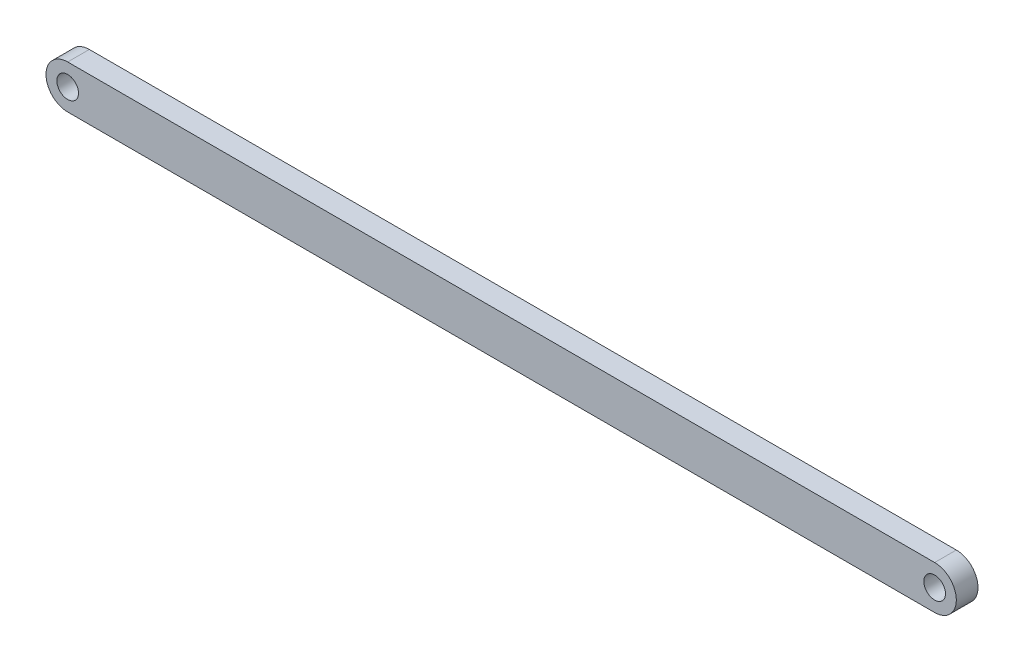
ISO-10303-21;
HEADER;
FILE_DESCRIPTION(('STEP AP214'),'2;1');
FILE_NAME('part.step','',(''),(''),'','','');
FILE_SCHEMA(('AUTOMOTIVE_DESIGN { 1 0 10303 214 1 1 1 1 }'));
ENDSEC;
DATA;
#1=APPLICATION_CONTEXT('core data for automotive mechanical design processes');
#2=APPLICATION_PROTOCOL_DEFINITION('international standard','automotive_design',2000,#1);
#3=PRODUCT_CONTEXT('',#1,'mechanical');
#4=PRODUCT('Part','Part','',(#3));
#5=PRODUCT_RELATED_PRODUCT_CATEGORY('part','',(#4));
#6=PRODUCT_DEFINITION_FORMATION('','',#4);
#7=PRODUCT_DEFINITION_CONTEXT('part definition',#1,'design');
#8=PRODUCT_DEFINITION('design','',#6,#7);
#9=PRODUCT_DEFINITION_SHAPE('','',#8);
#10=(LENGTH_UNIT() NAMED_UNIT(*) SI_UNIT(.MILLI.,.METRE.));
#11=(NAMED_UNIT(*) PLANE_ANGLE_UNIT() SI_UNIT($,.RADIAN.));
#12=(NAMED_UNIT(*) SI_UNIT($,.STERADIAN.) SOLID_ANGLE_UNIT());
#13=UNCERTAINTY_MEASURE_WITH_UNIT(LENGTH_MEASURE(1.E-05),#10,'distance_accuracy_value','');
#14=(GEOMETRIC_REPRESENTATION_CONTEXT(3) GLOBAL_UNCERTAINTY_ASSIGNED_CONTEXT((#13)) GLOBAL_UNIT_ASSIGNED_CONTEXT((#10,
#11,#12)) REPRESENTATION_CONTEXT('',''));
#15=CARTESIAN_POINT('',(0.,0.,0.));
#16=DIRECTION('',(0.,0.,1.));
#17=DIRECTION('',(1.,0.,0.));
#18=AXIS2_PLACEMENT_3D('',#15,#16,#17);
#19=CARTESIAN_POINT('',(0.,0.,5.));
#20=DIRECTION('',(0.,0.,1.));
#21=DIRECTION('',(1.,0.,0.));
#22=AXIS2_PLACEMENT_3D('',#19,#20,#21);
#23=PLANE('',#22);
#24=CARTESIAN_POINT('',(0.,0.,5.));
#25=DIRECTION('',(0.,0.,1.));
#26=DIRECTION('',(1.,0.,0.));
#27=AXIS2_PLACEMENT_3D('',#24,#25,#26);
#28=CIRCLE('',#27,2.5);
#29=CARTESIAN_POINT('',(2.5,0.,5.));
#30=VERTEX_POINT('',#29);
#31=EDGE_CURVE('E118',#30,#30,#28,.T.);
#32=ORIENTED_EDGE('',*,*,#31,.F.);
#33=EDGE_LOOP('',(#32));
#34=FACE_BOUND('',#33,.T.);
#35=CARTESIAN_POINT('',(0.,0.,5.));
#36=DIRECTION('',(0.,0.,1.));
#37=DIRECTION('',(1.,0.,0.));
#38=AXIS2_PLACEMENT_3D('',#35,#36,#37);
#39=CIRCLE('',#38,5.);
#40=CARTESIAN_POINT('',(0.,5.,5.));
#41=VERTEX_POINT('',#40);
#42=CARTESIAN_POINT('',(0.,-5.,5.));
#43=VERTEX_POINT('',#42);
#44=EDGE_CURVE('E98',#41,#43,#39,.T.);
#45=ORIENTED_EDGE('',*,*,#44,.T.);
#46=DIRECTION('',(1.,0.,0.));
#47=VECTOR('',#46,1.);
#48=CARTESIAN_POINT('',(0.,-5.,5.));
#49=LINE('',#48,#47);
#50=CARTESIAN_POINT('',(200.,-5.,5.));
#51=VERTEX_POINT('',#50);
#52=EDGE_CURVE('E93',#43,#51,#49,.T.);
#53=ORIENTED_EDGE('',*,*,#52,.T.);
#54=CARTESIAN_POINT('',(200.,0.,5.));
#55=DIRECTION('',(0.,0.,1.));
#56=DIRECTION('',(1.,0.,0.));
#57=AXIS2_PLACEMENT_3D('',#54,#55,#56);
#58=CIRCLE('',#57,5.);
#59=CARTESIAN_POINT('',(200.,5.,5.));
#60=VERTEX_POINT('',#59);
#61=EDGE_CURVE('E96',#51,#60,#58,.T.);
#62=ORIENTED_EDGE('',*,*,#61,.T.);
#63=DIRECTION('',(-1.,0.,0.));
#64=VECTOR('',#63,1.);
#65=CARTESIAN_POINT('',(0.,5.,5.));
#66=LINE('',#65,#64);
#67=EDGE_CURVE('E63',#60,#41,#66,.T.);
#68=ORIENTED_EDGE('',*,*,#67,.T.);
#69=EDGE_LOOP('',(#45,#53,#62,#68));
#70=FACE_BOUND('',#69,.T.);
#71=CARTESIAN_POINT('',(200.,0.,5.));
#72=DIRECTION('',(0.,0.,1.));
#73=DIRECTION('',(1.,0.,0.));
#74=AXIS2_PLACEMENT_3D('',#71,#72,#73);
#75=CIRCLE('',#74,2.5);
#76=CARTESIAN_POINT('',(202.5,0.,5.));
#77=VERTEX_POINT('',#76);
#78=EDGE_CURVE('E140',#77,#77,#75,.T.);
#79=ORIENTED_EDGE('',*,*,#78,.F.);
#80=EDGE_LOOP('',(#79));
#81=FACE_BOUND('',#80,.T.);
#82=ADVANCED_FACE('F45',(#34,#70,#81),#23,.T.);
#83=CARTESIAN_POINT('',(0.,0.,0.));
#84=DIRECTION('',(0.,0.,1.));
#85=DIRECTION('',(1.,0.,0.));
#86=AXIS2_PLACEMENT_3D('',#83,#84,#85);
#87=PLANE('',#86);
#88=CARTESIAN_POINT('',(0.,0.,0.));
#89=DIRECTION('',(0.,0.,1.));
#90=DIRECTION('',(1.,0.,0.));
#91=AXIS2_PLACEMENT_3D('',#88,#89,#90);
#92=CIRCLE('',#91,5.);
#93=CARTESIAN_POINT('',(0.,5.,0.));
#94=VERTEX_POINT('',#93);
#95=CARTESIAN_POINT('',(0.,-5.,0.));
#96=VERTEX_POINT('',#95);
#97=EDGE_CURVE('E114',#94,#96,#92,.T.);
#98=ORIENTED_EDGE('',*,*,#97,.F.);
#99=DIRECTION('',(-1.,0.,0.));
#100=VECTOR('',#99,1.);
#101=CARTESIAN_POINT('',(0.,5.,0.));
#102=LINE('',#101,#100);
#103=CARTESIAN_POINT('',(200.,5.,0.));
#104=VERTEX_POINT('',#103);
#105=EDGE_CURVE('E86',#104,#94,#102,.T.);
#106=ORIENTED_EDGE('',*,*,#105,.F.);
#107=CARTESIAN_POINT('',(200.,0.,0.));
#108=DIRECTION('',(0.,0.,1.));
#109=DIRECTION('',(1.,0.,0.));
#110=AXIS2_PLACEMENT_3D('',#107,#108,#109);
#111=CIRCLE('',#110,5.);
#112=CARTESIAN_POINT('',(200.,-5.,0.));
#113=VERTEX_POINT('',#112);
#114=EDGE_CURVE('E80',#113,#104,#111,.T.);
#115=ORIENTED_EDGE('',*,*,#114,.F.);
#116=DIRECTION('',(1.,0.,0.));
#117=VECTOR('',#116,1.);
#118=CARTESIAN_POINT('',(0.,-5.,0.));
#119=LINE('',#118,#117);
#120=EDGE_CURVE('E103',#96,#113,#119,.T.);
#121=ORIENTED_EDGE('',*,*,#120,.F.);
#122=EDGE_LOOP('',(#98,#106,#115,#121));
#123=FACE_BOUND('',#122,.T.);
#124=CARTESIAN_POINT('',(0.,0.,0.));
#125=DIRECTION('',(0.,0.,1.));
#126=DIRECTION('',(1.,0.,0.));
#127=AXIS2_PLACEMENT_3D('',#124,#125,#126);
#128=CIRCLE('',#127,2.5);
#129=CARTESIAN_POINT('',(2.5,0.,0.));
#130=VERTEX_POINT('',#129);
#131=EDGE_CURVE('E136',#130,#130,#128,.T.);
#132=ORIENTED_EDGE('',*,*,#131,.T.);
#133=EDGE_LOOP('',(#132));
#134=FACE_BOUND('',#133,.T.);
#135=CARTESIAN_POINT('',(200.,0.,0.));
#136=DIRECTION('',(0.,0.,1.));
#137=DIRECTION('',(1.,0.,0.));
#138=AXIS2_PLACEMENT_3D('',#135,#136,#137);
#139=CIRCLE('',#138,2.5);
#140=CARTESIAN_POINT('',(202.5,0.,0.));
#141=VERTEX_POINT('',#140);
#142=EDGE_CURVE('E144',#141,#141,#139,.T.);
#143=ORIENTED_EDGE('',*,*,#142,.T.);
#144=EDGE_LOOP('',(#143));
#145=FACE_BOUND('',#144,.T.);
#146=ADVANCED_FACE('F131',(#123,#134,#145),#87,.F.);
#147=CARTESIAN_POINT('',(0.,0.,5.));
#148=DIRECTION('',(0.,0.,-1.));
#149=DIRECTION('',(-1.,0.,0.));
#150=AXIS2_PLACEMENT_3D('',#147,#148,#149);
#151=CYLINDRICAL_SURFACE('',#150,5.);
#152=ORIENTED_EDGE('',*,*,#97,.T.);
#153=DIRECTION('',(0.,0.,-1.));
#154=VECTOR('',#153,1.);
#155=CARTESIAN_POINT('',(0.,-5.,5.));
#156=LINE('',#155,#154);
#157=EDGE_CURVE('E11',#43,#96,#156,.T.);
#158=ORIENTED_EDGE('',*,*,#157,.F.);
#159=ORIENTED_EDGE('',*,*,#44,.F.);
#160=DIRECTION('',(0.,0.,-1.));
#161=VECTOR('',#160,1.);
#162=CARTESIAN_POINT('',(0.,5.,5.));
#163=LINE('',#162,#161);
#164=EDGE_CURVE('E110',#41,#94,#163,.T.);
#165=ORIENTED_EDGE('',*,*,#164,.T.);
#166=EDGE_LOOP('',(#152,#158,#159,#165));
#167=FACE_BOUND('',#166,.T.);
#168=ADVANCED_FACE('F47',(#167),#151,.T.);
#169=CARTESIAN_POINT('',(0.,-5.,5.));
#170=DIRECTION('',(0.,1.,0.));
#171=DIRECTION('',(0.,0.,1.));
#172=AXIS2_PLACEMENT_3D('',#169,#170,#171);
#173=PLANE('',#172);
#174=ORIENTED_EDGE('',*,*,#120,.T.);
#175=DIRECTION('',(0.,0.,-1.));
#176=VECTOR('',#175,1.);
#177=CARTESIAN_POINT('',(200.,-5.,5.));
#178=LINE('',#177,#176);
#179=EDGE_CURVE('E55',#51,#113,#178,.T.);
#180=ORIENTED_EDGE('',*,*,#179,.F.);
#181=ORIENTED_EDGE('',*,*,#52,.F.);
#182=ORIENTED_EDGE('',*,*,#157,.T.);
#183=EDGE_LOOP('',(#174,#180,#181,#182));
#184=FACE_BOUND('',#183,.T.);
#185=ADVANCED_FACE('F102',(#184),#173,.F.);
#186=CARTESIAN_POINT('',(200.,0.,5.));
#187=DIRECTION('',(0.,0.,-1.));
#188=DIRECTION('',(-1.,0.,0.));
#189=AXIS2_PLACEMENT_3D('',#186,#187,#188);
#190=CYLINDRICAL_SURFACE('',#189,5.);
#191=ORIENTED_EDGE('',*,*,#114,.T.);
#192=DIRECTION('',(0.,0.,-1.));
#193=VECTOR('',#192,1.);
#194=CARTESIAN_POINT('',(200.,5.,5.));
#195=LINE('',#194,#193);
#196=EDGE_CURVE('E105',#60,#104,#195,.T.);
#197=ORIENTED_EDGE('',*,*,#196,.F.);
#198=ORIENTED_EDGE('',*,*,#61,.F.);
#199=ORIENTED_EDGE('',*,*,#179,.T.);
#200=EDGE_LOOP('',(#191,#197,#198,#199));
#201=FACE_BOUND('',#200,.T.);
#202=ADVANCED_FACE('F106',(#201),#190,.T.);
#203=CARTESIAN_POINT('',(0.,5.,5.));
#204=DIRECTION('',(0.,-1.,0.));
#205=DIRECTION('',(0.,0.,-1.));
#206=AXIS2_PLACEMENT_3D('',#203,#204,#205);
#207=PLANE('',#206);
#208=ORIENTED_EDGE('',*,*,#105,.T.);
#209=ORIENTED_EDGE('',*,*,#164,.F.);
#210=ORIENTED_EDGE('',*,*,#67,.F.);
#211=ORIENTED_EDGE('',*,*,#196,.T.);
#212=EDGE_LOOP('',(#208,#209,#210,#211));
#213=FACE_BOUND('',#212,.T.);
#214=ADVANCED_FACE('F128',(#213),#207,.F.);
#215=CARTESIAN_POINT('',(0.,0.,5.));
#216=DIRECTION('',(0.,0.,-1.));
#217=DIRECTION('',(-1.,0.,0.));
#218=AXIS2_PLACEMENT_3D('',#215,#216,#217);
#219=CYLINDRICAL_SURFACE('',#218,2.5);
#220=ORIENTED_EDGE('',*,*,#31,.T.);
#221=EDGE_LOOP('',(#220));
#222=FACE_BOUND('',#221,.T.);
#223=ORIENTED_EDGE('',*,*,#131,.F.);
#224=EDGE_LOOP('',(#223));
#225=FACE_BOUND('',#224,.T.);
#226=ADVANCED_FACE('F163',(#222,#225),#219,.F.);
#227=CARTESIAN_POINT('',(200.,0.,5.));
#228=DIRECTION('',(0.,0.,-1.));
#229=DIRECTION('',(-1.,0.,0.));
#230=AXIS2_PLACEMENT_3D('',#227,#228,#229);
#231=CYLINDRICAL_SURFACE('',#230,2.5);
#232=ORIENTED_EDGE('',*,*,#78,.T.);
#233=EDGE_LOOP('',(#232));
#234=FACE_BOUND('',#233,.T.);
#235=ORIENTED_EDGE('',*,*,#142,.F.);
#236=EDGE_LOOP('',(#235));
#237=FACE_BOUND('',#236,.T.);
#238=ADVANCED_FACE('F152',(#234,#237),#231,.F.);
#239=CLOSED_SHELL('',(#82,#146,#168,#185,#202,#214,#226,#238));
#240=MANIFOLD_SOLID_BREP('B2',#239);
#241=ADVANCED_BREP_SHAPE_REPRESENTATION('',(#18,#240),#14);
#242=SHAPE_DEFINITION_REPRESENTATION(#9,#241);
ENDSEC;
END-ISO-10303-21;
